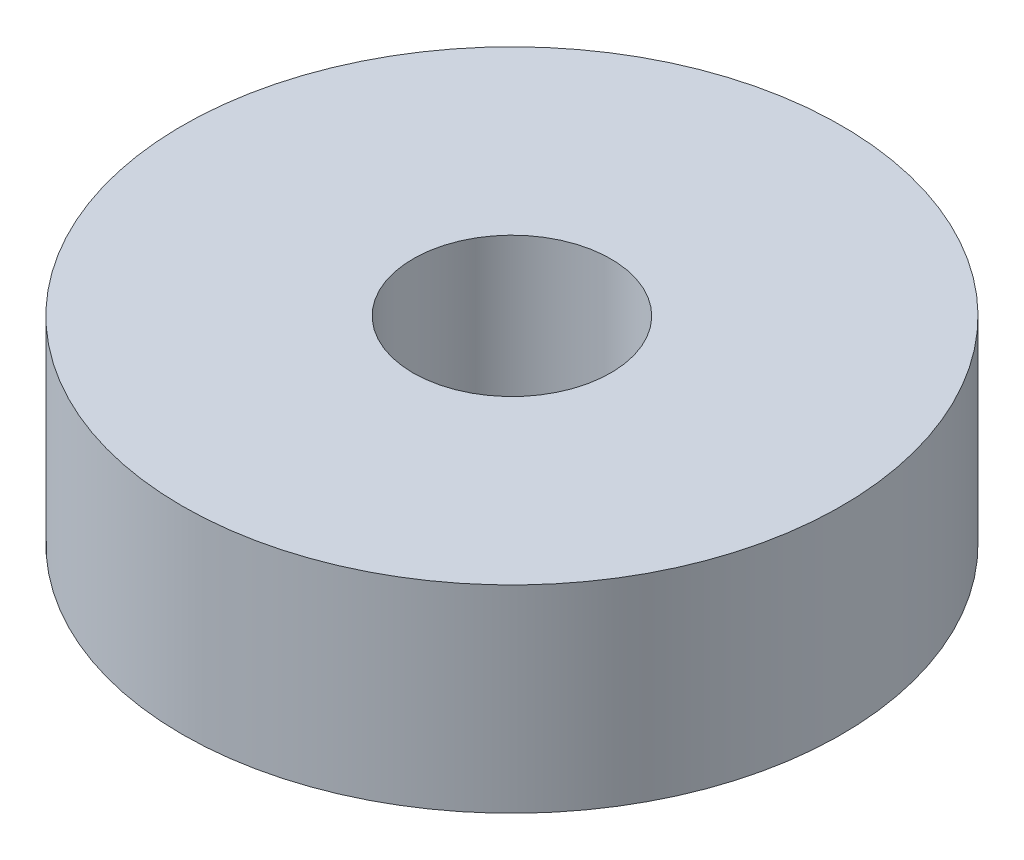
ISO-10303-21;
HEADER;
FILE_DESCRIPTION(('STEP AP214'),'2;1');
FILE_NAME('part.step','',(''),(''),'','','');
FILE_SCHEMA(('AUTOMOTIVE_DESIGN { 1 0 10303 214 1 1 1 1 }'));
ENDSEC;
DATA;
#1=APPLICATION_CONTEXT('core data for automotive mechanical design processes');
#2=APPLICATION_PROTOCOL_DEFINITION('international standard','automotive_design',2000,#1);
#3=PRODUCT_CONTEXT('',#1,'mechanical');
#4=PRODUCT('Part','Part','',(#3));
#5=PRODUCT_RELATED_PRODUCT_CATEGORY('part','',(#4));
#6=PRODUCT_DEFINITION_FORMATION('','',#4);
#7=PRODUCT_DEFINITION_CONTEXT('part definition',#1,'design');
#8=PRODUCT_DEFINITION('design','',#6,#7);
#9=PRODUCT_DEFINITION_SHAPE('','',#8);
#10=(LENGTH_UNIT() NAMED_UNIT(*) SI_UNIT(.MILLI.,.METRE.));
#11=(NAMED_UNIT(*) PLANE_ANGLE_UNIT() SI_UNIT($,.RADIAN.));
#12=(NAMED_UNIT(*) SI_UNIT($,.STERADIAN.) SOLID_ANGLE_UNIT());
#13=UNCERTAINTY_MEASURE_WITH_UNIT(LENGTH_MEASURE(1.E-05),#10,'distance_accuracy_value','');
#14=(GEOMETRIC_REPRESENTATION_CONTEXT(3) GLOBAL_UNCERTAINTY_ASSIGNED_CONTEXT((#13)) GLOBAL_UNIT_ASSIGNED_CONTEXT((#10,
#11,#12)) REPRESENTATION_CONTEXT('',''));
#15=CARTESIAN_POINT('',(0.,0.,0.));
#16=DIRECTION('',(0.,0.,1.));
#17=DIRECTION('',(1.,0.,0.));
#18=AXIS2_PLACEMENT_3D('',#15,#16,#17);
#19=CARTESIAN_POINT('',(0.,3.,0.));
#20=DIRECTION('',(0.,1.,0.));
#21=DIRECTION('',(0.,0.,1.));
#22=AXIS2_PLACEMENT_3D('',#19,#20,#21);
#23=PLANE('',#22);
#24=CARTESIAN_POINT('',(0.,3.,0.));
#25=DIRECTION('',(0.,1.,0.));
#26=DIRECTION('',(0.,0.,1.));
#27=AXIS2_PLACEMENT_3D('',#24,#25,#26);
#28=CIRCLE('',#27,5.);
#29=CARTESIAN_POINT('',(0.,3.,5.));
#30=VERTEX_POINT('',#29);
#31=EDGE_CURVE('E10',#30,#30,#28,.T.);
#32=ORIENTED_EDGE('',*,*,#31,.T.);
#33=EDGE_LOOP('',(#32));
#34=FACE_BOUND('',#33,.T.);
#35=CARTESIAN_POINT('',(0.,3.,0.));
#36=DIRECTION('',(0.,1.,0.));
#37=DIRECTION('',(0.,0.,1.));
#38=AXIS2_PLACEMENT_3D('',#35,#36,#37);
#39=CIRCLE('',#38,1.5);
#40=CARTESIAN_POINT('',(0.,3.,1.5));
#41=VERTEX_POINT('',#40);
#42=EDGE_CURVE('E52',#41,#41,#39,.T.);
#43=ORIENTED_EDGE('',*,*,#42,.F.);
#44=EDGE_LOOP('',(#43));
#45=FACE_BOUND('',#44,.T.);
#46=ADVANCED_FACE('F39',(#34,#45),#23,.T.);
#47=CARTESIAN_POINT('',(0.,0.,0.));
#48=DIRECTION('',(0.,1.,0.));
#49=DIRECTION('',(0.,0.,1.));
#50=AXIS2_PLACEMENT_3D('',#47,#48,#49);
#51=PLANE('',#50);
#52=CARTESIAN_POINT('',(0.,0.,0.));
#53=DIRECTION('',(0.,1.,0.));
#54=DIRECTION('',(0.,0.,1.));
#55=AXIS2_PLACEMENT_3D('',#52,#53,#54);
#56=CIRCLE('',#55,5.);
#57=CARTESIAN_POINT('',(0.,0.,5.));
#58=VERTEX_POINT('',#57);
#59=EDGE_CURVE('E43',#58,#58,#56,.T.);
#60=ORIENTED_EDGE('',*,*,#59,.F.);
#61=EDGE_LOOP('',(#60));
#62=FACE_BOUND('',#61,.T.);
#63=CARTESIAN_POINT('',(0.,0.,0.));
#64=DIRECTION('',(0.,1.,0.));
#65=DIRECTION('',(0.,0.,1.));
#66=AXIS2_PLACEMENT_3D('',#63,#64,#65);
#67=CIRCLE('',#66,1.5);
#68=CARTESIAN_POINT('',(0.,0.,1.5));
#69=VERTEX_POINT('',#68);
#70=EDGE_CURVE('E54',#69,#69,#67,.T.);
#71=ORIENTED_EDGE('',*,*,#70,.T.);
#72=EDGE_LOOP('',(#71));
#73=FACE_BOUND('',#72,.T.);
#74=ADVANCED_FACE('F66',(#62,#73),#51,.F.);
#75=CARTESIAN_POINT('',(0.,3.,0.));
#76=DIRECTION('',(0.,-1.,0.));
#77=DIRECTION('',(0.,0.,-1.));
#78=AXIS2_PLACEMENT_3D('',#75,#76,#77);
#79=CYLINDRICAL_SURFACE('',#78,5.);
#80=ORIENTED_EDGE('',*,*,#31,.F.);
#81=EDGE_LOOP('',(#80));
#82=FACE_BOUND('',#81,.T.);
#83=ORIENTED_EDGE('',*,*,#59,.T.);
#84=EDGE_LOOP('',(#83));
#85=FACE_BOUND('',#84,.T.);
#86=ADVANCED_FACE('F41',(#82,#85),#79,.T.);
#87=CARTESIAN_POINT('',(0.,3.,0.));
#88=DIRECTION('',(0.,-1.,0.));
#89=DIRECTION('',(0.,0.,-1.));
#90=AXIS2_PLACEMENT_3D('',#87,#88,#89);
#91=CYLINDRICAL_SURFACE('',#90,1.5);
#92=ORIENTED_EDGE('',*,*,#42,.T.);
#93=EDGE_LOOP('',(#92));
#94=FACE_BOUND('',#93,.T.);
#95=ORIENTED_EDGE('',*,*,#70,.F.);
#96=EDGE_LOOP('',(#95));
#97=FACE_BOUND('',#96,.T.);
#98=ADVANCED_FACE('F62',(#94,#97),#91,.F.);
#99=CLOSED_SHELL('',(#46,#74,#86,#98));
#100=MANIFOLD_SOLID_BREP('B2',#99);
#101=ADVANCED_BREP_SHAPE_REPRESENTATION('',(#18,#100),#14);
#102=SHAPE_DEFINITION_REPRESENTATION(#9,#101);
ENDSEC;
END-ISO-10303-21;
